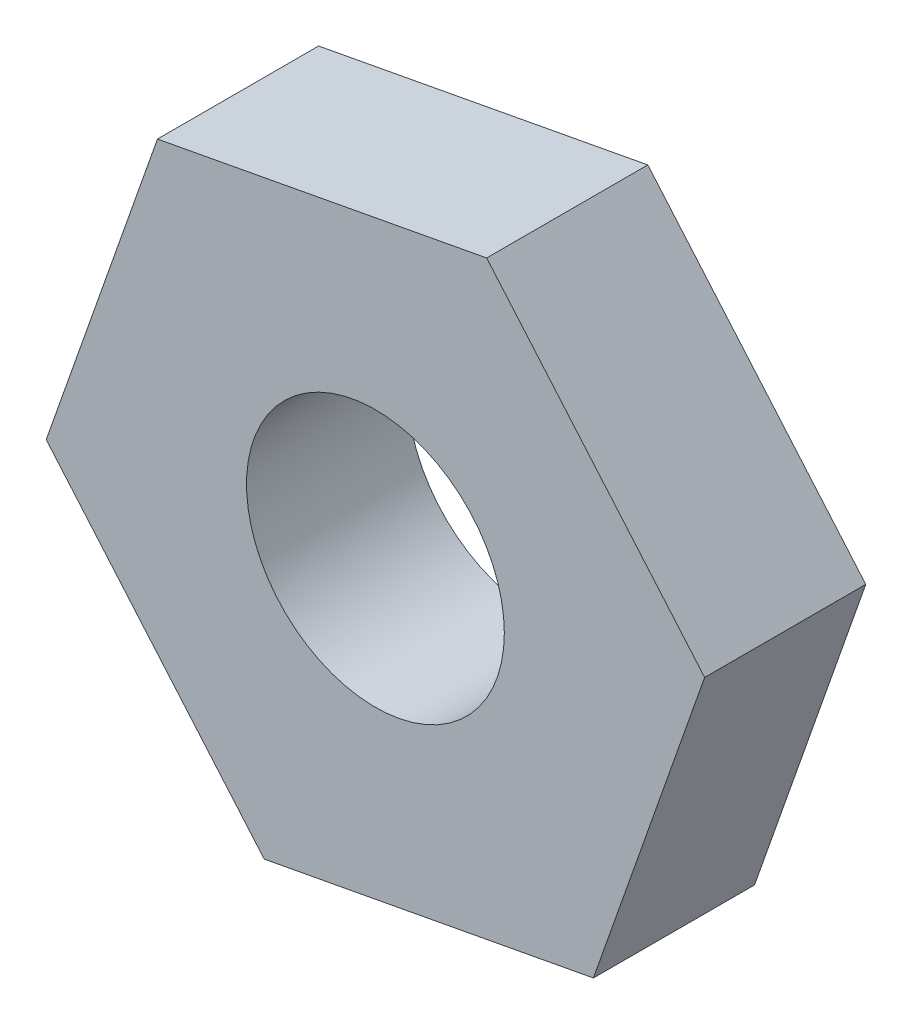
ISO-10303-21;
HEADER;
FILE_DESCRIPTION(('STEP AP214'),'2;1');
FILE_NAME('part.step','',(''),(''),'','','');
FILE_SCHEMA(('AUTOMOTIVE_DESIGN { 1 0 10303 214 1 1 1 1 }'));
ENDSEC;
DATA;
#1=APPLICATION_CONTEXT('core data for automotive mechanical design processes');
#2=APPLICATION_PROTOCOL_DEFINITION('international standard','automotive_design',2000,#1);
#3=PRODUCT_CONTEXT('',#1,'mechanical');
#4=PRODUCT('Part','Part','',(#3));
#5=PRODUCT_RELATED_PRODUCT_CATEGORY('part','',(#4));
#6=PRODUCT_DEFINITION_FORMATION('','',#4);
#7=PRODUCT_DEFINITION_CONTEXT('part definition',#1,'design');
#8=PRODUCT_DEFINITION('design','',#6,#7);
#9=PRODUCT_DEFINITION_SHAPE('','',#8);
#10=(LENGTH_UNIT() NAMED_UNIT(*) SI_UNIT(.MILLI.,.METRE.));
#11=(NAMED_UNIT(*) PLANE_ANGLE_UNIT() SI_UNIT($,.RADIAN.));
#12=(NAMED_UNIT(*) SI_UNIT($,.STERADIAN.) SOLID_ANGLE_UNIT());
#13=UNCERTAINTY_MEASURE_WITH_UNIT(LENGTH_MEASURE(1.E-05),#10,'distance_accuracy_value','');
#14=(GEOMETRIC_REPRESENTATION_CONTEXT(3) GLOBAL_UNCERTAINTY_ASSIGNED_CONTEXT((#13)) GLOBAL_UNIT_ASSIGNED_CONTEXT((#10,
#11,#12)) REPRESENTATION_CONTEXT('',''));
#15=CARTESIAN_POINT('',(0.,0.,0.));
#16=DIRECTION('',(0.,0.,1.));
#17=DIRECTION('',(1.,0.,0.));
#18=AXIS2_PLACEMENT_3D('',#15,#16,#17);
#19=CARTESIAN_POINT('',(0.,0.,2.5));
#20=DIRECTION('',(0.,0.,1.));
#21=DIRECTION('',(1.,0.,0.));
#22=AXIS2_PLACEMENT_3D('',#19,#20,#21);
#23=PLANE('',#22);
#24=DIRECTION('',(0.98293119236739,0.183973560793993,0.));
#25=VECTOR('',#24,1.);
#26=CARTESIAN_POINT('',(-3.45169824942779,-9.80233539494018,2.5));
#27=LINE('',#26,#25);
#28=CARTESIAN_POINT('',(-3.45169824942779,-9.80233539494018,2.5));
#29=VERTEX_POINT('',#28);
#30=CARTESIAN_POINT('',(6.76322234371967,-7.89042606767284,2.5));
#31=VERTEX_POINT('',#30);
#32=EDGE_CURVE('E146',#29,#31,#27,.T.);
#33=ORIENTED_EDGE('',*,*,#32,.T.);
#34=DIRECTION('',(0.332139818911416,0.943230163159285,0.));
#35=VECTOR('',#34,1.);
#36=CARTESIAN_POINT('',(6.76322234371967,-7.89042606767284,2.5));
#37=LINE('',#36,#35);
#38=CARTESIAN_POINT('',(10.2149205931475,1.91190932726735,2.5));
#39=VERTEX_POINT('',#38);
#40=EDGE_CURVE('E94',#31,#39,#37,.T.);
#41=ORIENTED_EDGE('',*,*,#40,.T.);
#42=DIRECTION('',(-0.650791373455974,0.759256602365292,0.));
#43=VECTOR('',#42,1.);
#44=CARTESIAN_POINT('',(10.2149205931475,1.91190932726735,2.5));
#45=LINE('',#44,#43);
#46=CARTESIAN_POINT('',(3.4516982494278,9.80233539494018,2.5));
#47=VERTEX_POINT('',#46);
#48=EDGE_CURVE('E107',#39,#47,#45,.T.);
#49=ORIENTED_EDGE('',*,*,#48,.T.);
#50=DIRECTION('',(-0.98293119236739,-0.183973560793993,0.));
#51=VECTOR('',#50,1.);
#52=CARTESIAN_POINT('',(3.4516982494278,9.80233539494018,2.5));
#53=LINE('',#52,#51);
#54=CARTESIAN_POINT('',(-6.76322234371966,7.89042606767284,2.5));
#55=VERTEX_POINT('',#54);
#56=EDGE_CURVE('E101',#47,#55,#53,.T.);
#57=ORIENTED_EDGE('',*,*,#56,.T.);
#58=DIRECTION('',(-0.332139818911417,-0.943230163159285,0.));
#59=VECTOR('',#58,1.);
#60=CARTESIAN_POINT('',(-6.76322234371966,7.89042606767284,2.5));
#61=LINE('',#60,#59);
#62=CARTESIAN_POINT('',(-10.2149205931475,-1.91190932726734,2.5));
#63=VERTEX_POINT('',#62);
#64=EDGE_CURVE('E105',#55,#63,#61,.T.);
#65=ORIENTED_EDGE('',*,*,#64,.T.);
#66=DIRECTION('',(0.650791373455974,-0.759256602365292,0.));
#67=VECTOR('',#66,1.);
#68=CARTESIAN_POINT('',(-10.2149205931475,-1.91190932726734,2.5));
#69=LINE('',#68,#67);
#70=EDGE_CURVE('E57',#63,#29,#69,.T.);
#71=ORIENTED_EDGE('',*,*,#70,.T.);
#72=EDGE_LOOP('',(#33,#41,#49,#57,#65,#71));
#73=FACE_BOUND('',#72,.T.);
#74=CARTESIAN_POINT('',(0.,0.,2.5));
#75=DIRECTION('',(0.,0.,1.));
#76=DIRECTION('',(1.,0.,0.));
#77=AXIS2_PLACEMENT_3D('',#74,#75,#76);
#78=CIRCLE('',#77,4.);
#79=CARTESIAN_POINT('',(4.,0.,2.5));
#80=VERTEX_POINT('',#79);
#81=EDGE_CURVE('E134',#80,#80,#78,.T.);
#82=ORIENTED_EDGE('',*,*,#81,.F.);
#83=EDGE_LOOP('',(#82));
#84=FACE_BOUND('',#83,.T.);
#85=ADVANCED_FACE('F39',(#73,#84),#23,.T.);
#86=CARTESIAN_POINT('',(0.,0.,-2.5));
#87=DIRECTION('',(0.,0.,1.));
#88=DIRECTION('',(1.,0.,0.));
#89=AXIS2_PLACEMENT_3D('',#86,#87,#88);
#90=PLANE('',#89);
#91=DIRECTION('',(0.98293119236739,0.183973560793993,0.));
#92=VECTOR('',#91,1.);
#93=CARTESIAN_POINT('',(-3.45169824942779,-9.80233539494018,-2.5));
#94=LINE('',#93,#92);
#95=CARTESIAN_POINT('',(-3.45169824942779,-9.80233539494018,-2.5));
#96=VERTEX_POINT('',#95);
#97=CARTESIAN_POINT('',(6.76322234371967,-7.89042606767284,-2.5));
#98=VERTEX_POINT('',#97);
#99=EDGE_CURVE('E129',#96,#98,#94,.T.);
#100=ORIENTED_EDGE('',*,*,#99,.F.);
#101=DIRECTION('',(0.650791373455974,-0.759256602365292,0.));
#102=VECTOR('',#101,1.);
#103=CARTESIAN_POINT('',(-10.2149205931475,-1.91190932726734,-2.5));
#104=LINE('',#103,#102);
#105=CARTESIAN_POINT('',(-10.2149205931475,-1.91190932726734,-2.5));
#106=VERTEX_POINT('',#105);
#107=EDGE_CURVE('E86',#106,#96,#104,.T.);
#108=ORIENTED_EDGE('',*,*,#107,.F.);
#109=DIRECTION('',(-0.332139818911417,-0.943230163159285,0.));
#110=VECTOR('',#109,1.);
#111=CARTESIAN_POINT('',(-6.76322234371966,7.89042606767284,-2.5));
#112=LINE('',#111,#110);
#113=CARTESIAN_POINT('',(-6.76322234371966,7.89042606767284,-2.5));
#114=VERTEX_POINT('',#113);
#115=EDGE_CURVE('E80',#114,#106,#112,.T.);
#116=ORIENTED_EDGE('',*,*,#115,.F.);
#117=DIRECTION('',(-0.98293119236739,-0.183973560793993,0.));
#118=VECTOR('',#117,1.);
#119=CARTESIAN_POINT('',(3.4516982494278,9.80233539494018,-2.5));
#120=LINE('',#119,#118);
#121=CARTESIAN_POINT('',(3.4516982494278,9.80233539494018,-2.5));
#122=VERTEX_POINT('',#121);
#123=EDGE_CURVE('E116',#122,#114,#120,.T.);
#124=ORIENTED_EDGE('',*,*,#123,.F.);
#125=DIRECTION('',(-0.650791373455974,0.759256602365292,0.));
#126=VECTOR('',#125,1.);
#127=CARTESIAN_POINT('',(10.2149205931475,1.91190932726735,-2.5));
#128=LINE('',#127,#126);
#129=CARTESIAN_POINT('',(10.2149205931475,1.91190932726735,-2.5));
#130=VERTEX_POINT('',#129);
#131=EDGE_CURVE('E137',#130,#122,#128,.T.);
#132=ORIENTED_EDGE('',*,*,#131,.F.);
#133=DIRECTION('',(0.332139818911416,0.943230163159285,0.));
#134=VECTOR('',#133,1.);
#135=CARTESIAN_POINT('',(6.76322234371967,-7.89042606767284,-2.5));
#136=LINE('',#135,#134);
#137=EDGE_CURVE('E133',#98,#130,#136,.T.);
#138=ORIENTED_EDGE('',*,*,#137,.F.);
#139=EDGE_LOOP('',(#100,#108,#116,#124,#132,#138));
#140=FACE_BOUND('',#139,.T.);
#141=CARTESIAN_POINT('',(0.,0.,-2.5));
#142=DIRECTION('',(0.,0.,1.));
#143=DIRECTION('',(1.,0.,0.));
#144=AXIS2_PLACEMENT_3D('',#141,#142,#143);
#145=CIRCLE('',#144,4.);
#146=CARTESIAN_POINT('',(4.,0.,-2.5));
#147=VERTEX_POINT('',#146);
#148=EDGE_CURVE('E243',#147,#147,#145,.T.);
#149=ORIENTED_EDGE('',*,*,#148,.T.);
#150=EDGE_LOOP('',(#149));
#151=FACE_BOUND('',#150,.T.);
#152=ADVANCED_FACE('F159',(#140,#151),#90,.F.);
#153=CARTESIAN_POINT('',(-3.45169824942779,-9.80233539494018,2.5));
#154=DIRECTION('',(-0.183973560793993,0.98293119236739,0.));
#155=DIRECTION('',(-0.98293119236739,-0.183973560793993,0.));
#156=AXIS2_PLACEMENT_3D('',#153,#154,#155);
#157=PLANE('',#156);
#158=ORIENTED_EDGE('',*,*,#99,.T.);
#159=DIRECTION('',(0.,0.,-1.));
#160=VECTOR('',#159,1.);
#161=CARTESIAN_POINT('',(6.76322234371967,-7.89042606767284,2.5));
#162=LINE('',#161,#160);
#163=EDGE_CURVE('E11',#31,#98,#162,.T.);
#164=ORIENTED_EDGE('',*,*,#163,.F.);
#165=ORIENTED_EDGE('',*,*,#32,.F.);
#166=DIRECTION('',(0.,0.,-1.));
#167=VECTOR('',#166,1.);
#168=CARTESIAN_POINT('',(-3.45169824942779,-9.80233539494018,2.5));
#169=LINE('',#168,#167);
#170=EDGE_CURVE('E125',#29,#96,#169,.T.);
#171=ORIENTED_EDGE('',*,*,#170,.T.);
#172=EDGE_LOOP('',(#158,#164,#165,#171));
#173=FACE_BOUND('',#172,.T.);
#174=ADVANCED_FACE('F41',(#173),#157,.F.);
#175=CARTESIAN_POINT('',(6.76322234371967,-7.89042606767284,2.5));
#176=DIRECTION('',(-0.943230163159285,0.332139818911416,0.));
#177=DIRECTION('',(-0.332139818911416,-0.943230163159285,0.));
#178=AXIS2_PLACEMENT_3D('',#175,#176,#177);
#179=PLANE('',#178);
#180=ORIENTED_EDGE('',*,*,#137,.T.);
#181=DIRECTION('',(0.,0.,-1.));
#182=VECTOR('',#181,1.);
#183=CARTESIAN_POINT('',(10.2149205931475,1.91190932726735,2.5));
#184=LINE('',#183,#182);
#185=EDGE_CURVE('E49',#39,#130,#184,.T.);
#186=ORIENTED_EDGE('',*,*,#185,.F.);
#187=ORIENTED_EDGE('',*,*,#40,.F.);
#188=ORIENTED_EDGE('',*,*,#163,.T.);
#189=EDGE_LOOP('',(#180,#186,#187,#188));
#190=FACE_BOUND('',#189,.T.);
#191=ADVANCED_FACE('F184',(#190),#179,.F.);
#192=CARTESIAN_POINT('',(10.2149205931475,1.91190932726735,2.5));
#193=DIRECTION('',(-0.759256602365292,-0.650791373455974,0.));
#194=DIRECTION('',(0.650791373455974,-0.759256602365292,0.));
#195=AXIS2_PLACEMENT_3D('',#192,#193,#194);
#196=PLANE('',#195);
#197=ORIENTED_EDGE('',*,*,#131,.T.);
#198=DIRECTION('',(0.,0.,-1.));
#199=VECTOR('',#198,1.);
#200=CARTESIAN_POINT('',(3.4516982494278,9.80233539494018,2.5));
#201=LINE('',#200,#199);
#202=EDGE_CURVE('E118',#47,#122,#201,.T.);
#203=ORIENTED_EDGE('',*,*,#202,.F.);
#204=ORIENTED_EDGE('',*,*,#48,.F.);
#205=ORIENTED_EDGE('',*,*,#185,.T.);
#206=EDGE_LOOP('',(#197,#203,#204,#205));
#207=FACE_BOUND('',#206,.T.);
#208=ADVANCED_FACE('F156',(#207),#196,.F.);
#209=CARTESIAN_POINT('',(3.4516982494278,9.80233539494018,2.5));
#210=DIRECTION('',(0.183973560793993,-0.98293119236739,0.));
#211=DIRECTION('',(0.98293119236739,0.183973560793993,0.));
#212=AXIS2_PLACEMENT_3D('',#209,#210,#211);
#213=PLANE('',#212);
#214=ORIENTED_EDGE('',*,*,#123,.T.);
#215=DIRECTION('',(0.,0.,-1.));
#216=VECTOR('',#215,1.);
#217=CARTESIAN_POINT('',(-6.76322234371966,7.89042606767284,2.5));
#218=LINE('',#217,#216);
#219=EDGE_CURVE('E113',#55,#114,#218,.T.);
#220=ORIENTED_EDGE('',*,*,#219,.F.);
#221=ORIENTED_EDGE('',*,*,#56,.F.);
#222=ORIENTED_EDGE('',*,*,#202,.T.);
#223=EDGE_LOOP('',(#214,#220,#221,#222));
#224=FACE_BOUND('',#223,.T.);
#225=ADVANCED_FACE('F114',(#224),#213,.F.);
#226=CARTESIAN_POINT('',(-6.76322234371966,7.89042606767284,2.5));
#227=DIRECTION('',(0.943230163159285,-0.332139818911417,0.));
#228=DIRECTION('',(0.332139818911417,0.943230163159285,0.));
#229=AXIS2_PLACEMENT_3D('',#226,#227,#228);
#230=PLANE('',#229);
#231=ORIENTED_EDGE('',*,*,#115,.T.);
#232=DIRECTION('',(0.,0.,-1.));
#233=VECTOR('',#232,1.);
#234=CARTESIAN_POINT('',(-10.2149205931475,-1.91190932726734,2.5));
#235=LINE('',#234,#233);
#236=EDGE_CURVE('E119',#63,#106,#235,.T.);
#237=ORIENTED_EDGE('',*,*,#236,.F.);
#238=ORIENTED_EDGE('',*,*,#64,.F.);
#239=ORIENTED_EDGE('',*,*,#219,.T.);
#240=EDGE_LOOP('',(#231,#237,#238,#239));
#241=FACE_BOUND('',#240,.T.);
#242=ADVANCED_FACE('F121',(#241),#230,.F.);
#243=CARTESIAN_POINT('',(-10.2149205931475,-1.91190932726734,2.5));
#244=DIRECTION('',(0.759256602365292,0.650791373455974,0.));
#245=DIRECTION('',(-0.650791373455974,0.759256602365292,0.));
#246=AXIS2_PLACEMENT_3D('',#243,#244,#245);
#247=PLANE('',#246);
#248=ORIENTED_EDGE('',*,*,#107,.T.);
#249=ORIENTED_EDGE('',*,*,#170,.F.);
#250=ORIENTED_EDGE('',*,*,#70,.F.);
#251=ORIENTED_EDGE('',*,*,#236,.T.);
#252=EDGE_LOOP('',(#248,#249,#250,#251));
#253=FACE_BOUND('',#252,.T.);
#254=ADVANCED_FACE('F164',(#253),#247,.F.);
#255=CARTESIAN_POINT('',(0.,0.,2.5));
#256=DIRECTION('',(0.,0.,-1.));
#257=DIRECTION('',(-1.,0.,0.));
#258=AXIS2_PLACEMENT_3D('',#255,#256,#257);
#259=CYLINDRICAL_SURFACE('',#258,4.);
#260=ORIENTED_EDGE('',*,*,#81,.T.);
#261=EDGE_LOOP('',(#260));
#262=FACE_BOUND('',#261,.T.);
#263=ORIENTED_EDGE('',*,*,#148,.F.);
#264=EDGE_LOOP('',(#263));
#265=FACE_BOUND('',#264,.T.);
#266=ADVANCED_FACE('F166',(#262,#265),#259,.F.);
#267=CLOSED_SHELL('',(#85,#152,#174,#191,#208,#225,#242,#254,#266));
#268=MANIFOLD_SOLID_BREP('B2',#267);
#269=ADVANCED_BREP_SHAPE_REPRESENTATION('',(#18,#268),#14);
#270=SHAPE_DEFINITION_REPRESENTATION(#9,#269);
ENDSEC;
END-ISO-10303-21;
